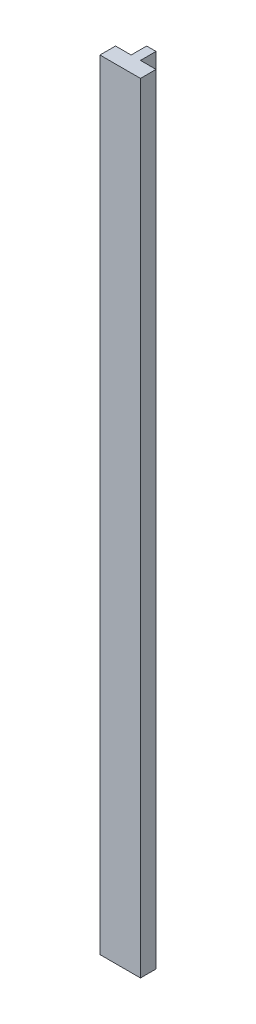
ISO-10303-21;
HEADER;
FILE_DESCRIPTION(('STEP AP214'),'2;1');
FILE_NAME('part.step','',(''),(''),'','','');
FILE_SCHEMA(('AUTOMOTIVE_DESIGN { 1 0 10303 214 1 1 1 1 }'));
ENDSEC;
DATA;
#1=APPLICATION_CONTEXT('core data for automotive mechanical design processes');
#2=APPLICATION_PROTOCOL_DEFINITION('international standard','automotive_design',2000,#1);
#3=PRODUCT_CONTEXT('',#1,'mechanical');
#4=PRODUCT('Part','Part','',(#3));
#5=PRODUCT_RELATED_PRODUCT_CATEGORY('part','',(#4));
#6=PRODUCT_DEFINITION_FORMATION('','',#4);
#7=PRODUCT_DEFINITION_CONTEXT('part definition',#1,'design');
#8=PRODUCT_DEFINITION('design','',#6,#7);
#9=PRODUCT_DEFINITION_SHAPE('','',#8);
#10=(LENGTH_UNIT() NAMED_UNIT(*) SI_UNIT(.MILLI.,.METRE.));
#11=(NAMED_UNIT(*) PLANE_ANGLE_UNIT() SI_UNIT($,.RADIAN.));
#12=(NAMED_UNIT(*) SI_UNIT($,.STERADIAN.) SOLID_ANGLE_UNIT());
#13=UNCERTAINTY_MEASURE_WITH_UNIT(LENGTH_MEASURE(1.E-05),#10,'distance_accuracy_value','');
#14=(GEOMETRIC_REPRESENTATION_CONTEXT(3) GLOBAL_UNCERTAINTY_ASSIGNED_CONTEXT((#13)) GLOBAL_UNIT_ASSIGNED_CONTEXT((#10,
#11,#12)) REPRESENTATION_CONTEXT('',''));
#15=CARTESIAN_POINT('',(0.,0.,0.));
#16=DIRECTION('',(0.,0.,1.));
#17=DIRECTION('',(1.,0.,0.));
#18=AXIS2_PLACEMENT_3D('',#15,#16,#17);
#19=CARTESIAN_POINT('',(0.,500.,10.));
#20=DIRECTION('',(1.,0.,0.));
#21=DIRECTION('',(0.,0.,-1.));
#22=AXIS2_PLACEMENT_3D('',#19,#20,#21);
#23=PLANE('',#22);
#24=DIRECTION('',(0.,0.,1.));
#25=VECTOR('',#24,1.);
#26=CARTESIAN_POINT('',(0.,0.,10.));
#27=LINE('',#26,#25);
#28=CARTESIAN_POINT('',(0.,0.,0.));
#29=VERTEX_POINT('',#28);
#30=CARTESIAN_POINT('',(0.,0.,10.));
#31=VERTEX_POINT('',#30);
#32=EDGE_CURVE('E140',#29,#31,#27,.T.);
#33=ORIENTED_EDGE('',*,*,#32,.T.);
#34=DIRECTION('',(0.,-1.,0.));
#35=VECTOR('',#34,1.);
#36=CARTESIAN_POINT('',(0.,500.,10.));
#37=LINE('',#36,#35);
#38=CARTESIAN_POINT('',(0.,500.,10.));
#39=VERTEX_POINT('',#38);
#40=EDGE_CURVE('E11',#39,#31,#37,.T.);
#41=ORIENTED_EDGE('',*,*,#40,.F.);
#42=DIRECTION('',(0.,0.,1.));
#43=VECTOR('',#42,1.);
#44=CARTESIAN_POINT('',(0.,500.,10.));
#45=LINE('',#44,#43);
#46=CARTESIAN_POINT('',(0.,500.,0.));
#47=VERTEX_POINT('',#46);
#48=EDGE_CURVE('E162',#47,#39,#45,.T.);
#49=ORIENTED_EDGE('',*,*,#48,.F.);
#50=DIRECTION('',(0.,-1.,0.));
#51=VECTOR('',#50,1.);
#52=CARTESIAN_POINT('',(0.,500.,0.));
#53=LINE('',#52,#51);
#54=EDGE_CURVE('E136',#47,#29,#53,.T.);
#55=ORIENTED_EDGE('',*,*,#54,.T.);
#56=EDGE_LOOP('',(#33,#41,#49,#55));
#57=FACE_BOUND('',#56,.T.);
#58=ADVANCED_FACE('F39',(#57),#23,.F.);
#59=CARTESIAN_POINT('',(26.,500.,10.));
#60=DIRECTION('',(0.,0.,-1.));
#61=DIRECTION('',(-1.,0.,0.));
#62=AXIS2_PLACEMENT_3D('',#59,#60,#61);
#63=PLANE('',#62);
#64=DIRECTION('',(1.,0.,0.));
#65=VECTOR('',#64,1.);
#66=CARTESIAN_POINT('',(26.,0.,10.));
#67=LINE('',#66,#65);
#68=CARTESIAN_POINT('',(26.,0.,10.));
#69=VERTEX_POINT('',#68);
#70=EDGE_CURVE('E144',#31,#69,#67,.T.);
#71=ORIENTED_EDGE('',*,*,#70,.T.);
#72=DIRECTION('',(0.,-1.,0.));
#73=VECTOR('',#72,1.);
#74=CARTESIAN_POINT('',(26.,500.,10.));
#75=LINE('',#74,#73);
#76=CARTESIAN_POINT('',(26.,500.,10.));
#77=VERTEX_POINT('',#76);
#78=EDGE_CURVE('E48',#77,#69,#75,.T.);
#79=ORIENTED_EDGE('',*,*,#78,.F.);
#80=DIRECTION('',(1.,0.,0.));
#81=VECTOR('',#80,1.);
#82=CARTESIAN_POINT('',(26.,500.,10.));
#83=LINE('',#82,#81);
#84=EDGE_CURVE('E99',#39,#77,#83,.T.);
#85=ORIENTED_EDGE('',*,*,#84,.F.);
#86=ORIENTED_EDGE('',*,*,#40,.T.);
#87=EDGE_LOOP('',(#71,#79,#85,#86));
#88=FACE_BOUND('',#87,.T.);
#89=ADVANCED_FACE('F208',(#88),#63,.F.);
#90=CARTESIAN_POINT('',(26.,500.,0.));
#91=DIRECTION('',(-1.,0.,0.));
#92=DIRECTION('',(0.,0.,1.));
#93=AXIS2_PLACEMENT_3D('',#90,#91,#92);
#94=PLANE('',#93);
#95=DIRECTION('',(0.,0.,-1.));
#96=VECTOR('',#95,1.);
#97=CARTESIAN_POINT('',(26.,0.,0.));
#98=LINE('',#97,#96);
#99=CARTESIAN_POINT('',(26.,0.,0.));
#100=VERTEX_POINT('',#99);
#101=EDGE_CURVE('E147',#69,#100,#98,.T.);
#102=ORIENTED_EDGE('',*,*,#101,.T.);
#103=DIRECTION('',(0.,-1.,0.));
#104=VECTOR('',#103,1.);
#105=CARTESIAN_POINT('',(26.,500.,0.));
#106=LINE('',#105,#104);
#107=CARTESIAN_POINT('',(26.,500.,0.));
#108=VERTEX_POINT('',#107);
#109=EDGE_CURVE('E173',#108,#100,#106,.T.);
#110=ORIENTED_EDGE('',*,*,#109,.F.);
#111=DIRECTION('',(0.,0.,-1.));
#112=VECTOR('',#111,1.);
#113=CARTESIAN_POINT('',(26.,500.,0.));
#114=LINE('',#113,#112);
#115=EDGE_CURVE('E183',#77,#108,#114,.T.);
#116=ORIENTED_EDGE('',*,*,#115,.F.);
#117=ORIENTED_EDGE('',*,*,#78,.T.);
#118=EDGE_LOOP('',(#102,#110,#116,#117));
#119=FACE_BOUND('',#118,.T.);
#120=ADVANCED_FACE('F181',(#119),#94,.F.);
#121=CARTESIAN_POINT('',(16.,500.,0.));
#122=DIRECTION('',(0.,0.,1.));
#123=DIRECTION('',(1.,0.,0.));
#124=AXIS2_PLACEMENT_3D('',#121,#122,#123);
#125=PLANE('',#124);
#126=DIRECTION('',(-1.,0.,0.));
#127=VECTOR('',#126,1.);
#128=CARTESIAN_POINT('',(16.,0.,0.));
#129=LINE('',#128,#127);
#130=CARTESIAN_POINT('',(16.,0.,0.));
#131=VERTEX_POINT('',#130);
#132=EDGE_CURVE('E150',#100,#131,#129,.T.);
#133=ORIENTED_EDGE('',*,*,#132,.T.);
#134=DIRECTION('',(0.,-1.,0.));
#135=VECTOR('',#134,1.);
#136=CARTESIAN_POINT('',(16.,500.,0.));
#137=LINE('',#136,#135);
#138=CARTESIAN_POINT('',(16.,500.,0.));
#139=VERTEX_POINT('',#138);
#140=EDGE_CURVE('E169',#139,#131,#137,.T.);
#141=ORIENTED_EDGE('',*,*,#140,.F.);
#142=DIRECTION('',(-1.,0.,0.));
#143=VECTOR('',#142,1.);
#144=CARTESIAN_POINT('',(16.,500.,0.));
#145=LINE('',#144,#143);
#146=EDGE_CURVE('E196',#108,#139,#145,.T.);
#147=ORIENTED_EDGE('',*,*,#146,.F.);
#148=ORIENTED_EDGE('',*,*,#109,.T.);
#149=EDGE_LOOP('',(#133,#141,#147,#148));
#150=FACE_BOUND('',#149,.T.);
#151=ADVANCED_FACE('F191',(#150),#125,.F.);
#152=CARTESIAN_POINT('',(16.,500.,-10.));
#153=DIRECTION('',(-1.,0.,0.));
#154=DIRECTION('',(0.,0.,1.));
#155=AXIS2_PLACEMENT_3D('',#152,#153,#154);
#156=PLANE('',#155);
#157=DIRECTION('',(0.,0.,-1.));
#158=VECTOR('',#157,1.);
#159=CARTESIAN_POINT('',(16.,0.,-10.));
#160=LINE('',#159,#158);
#161=CARTESIAN_POINT('',(16.,0.,-10.));
#162=VERTEX_POINT('',#161);
#163=EDGE_CURVE('E153',#131,#162,#160,.T.);
#164=ORIENTED_EDGE('',*,*,#163,.T.);
#165=DIRECTION('',(0.,-1.,0.));
#166=VECTOR('',#165,1.);
#167=CARTESIAN_POINT('',(16.,500.,-10.));
#168=LINE('',#167,#166);
#169=CARTESIAN_POINT('',(16.,500.,-10.));
#170=VERTEX_POINT('',#169);
#171=EDGE_CURVE('E129',#170,#162,#168,.T.);
#172=ORIENTED_EDGE('',*,*,#171,.F.);
#173=DIRECTION('',(0.,0.,-1.));
#174=VECTOR('',#173,1.);
#175=CARTESIAN_POINT('',(16.,500.,-10.));
#176=LINE('',#175,#174);
#177=EDGE_CURVE('E118',#139,#170,#176,.T.);
#178=ORIENTED_EDGE('',*,*,#177,.F.);
#179=ORIENTED_EDGE('',*,*,#140,.T.);
#180=EDGE_LOOP('',(#164,#172,#178,#179));
#181=FACE_BOUND('',#180,.T.);
#182=ADVANCED_FACE('F194',(#181),#156,.F.);
#183=CARTESIAN_POINT('',(10.,500.,-10.));
#184=DIRECTION('',(0.,0.,1.));
#185=DIRECTION('',(1.,0.,0.));
#186=AXIS2_PLACEMENT_3D('',#183,#184,#185);
#187=PLANE('',#186);
#188=DIRECTION('',(-1.,0.,0.));
#189=VECTOR('',#188,1.);
#190=CARTESIAN_POINT('',(10.,0.,-10.));
#191=LINE('',#190,#189);
#192=CARTESIAN_POINT('',(10.,0.,-10.));
#193=VERTEX_POINT('',#192);
#194=EDGE_CURVE('E127',#162,#193,#191,.T.);
#195=ORIENTED_EDGE('',*,*,#194,.T.);
#196=DIRECTION('',(0.,-1.,0.));
#197=VECTOR('',#196,1.);
#198=CARTESIAN_POINT('',(10.,500.,-10.));
#199=LINE('',#198,#197);
#200=CARTESIAN_POINT('',(10.,500.,-10.));
#201=VERTEX_POINT('',#200);
#202=EDGE_CURVE('E124',#201,#193,#199,.T.);
#203=ORIENTED_EDGE('',*,*,#202,.F.);
#204=DIRECTION('',(-1.,0.,0.));
#205=VECTOR('',#204,1.);
#206=CARTESIAN_POINT('',(10.,500.,-10.));
#207=LINE('',#206,#205);
#208=EDGE_CURVE('E112',#170,#201,#207,.T.);
#209=ORIENTED_EDGE('',*,*,#208,.F.);
#210=ORIENTED_EDGE('',*,*,#171,.T.);
#211=EDGE_LOOP('',(#195,#203,#209,#210));
#212=FACE_BOUND('',#211,.T.);
#213=ADVANCED_FACE('F125',(#212),#187,.F.);
#214=CARTESIAN_POINT('',(10.,500.,0.));
#215=DIRECTION('',(1.,0.,0.));
#216=DIRECTION('',(0.,0.,-1.));
#217=AXIS2_PLACEMENT_3D('',#214,#215,#216);
#218=PLANE('',#217);
#219=DIRECTION('',(0.,0.,1.));
#220=VECTOR('',#219,1.);
#221=CARTESIAN_POINT('',(10.,0.,0.));
#222=LINE('',#221,#220);
#223=CARTESIAN_POINT('',(10.,0.,0.));
#224=VERTEX_POINT('',#223);
#225=EDGE_CURVE('E85',#193,#224,#222,.T.);
#226=ORIENTED_EDGE('',*,*,#225,.T.);
#227=DIRECTION('',(0.,-1.,0.));
#228=VECTOR('',#227,1.);
#229=CARTESIAN_POINT('',(10.,500.,0.));
#230=LINE('',#229,#228);
#231=CARTESIAN_POINT('',(10.,500.,0.));
#232=VERTEX_POINT('',#231);
#233=EDGE_CURVE('E130',#232,#224,#230,.T.);
#234=ORIENTED_EDGE('',*,*,#233,.F.);
#235=DIRECTION('',(0.,0.,1.));
#236=VECTOR('',#235,1.);
#237=CARTESIAN_POINT('',(10.,500.,0.));
#238=LINE('',#237,#236);
#239=EDGE_CURVE('E116',#201,#232,#238,.T.);
#240=ORIENTED_EDGE('',*,*,#239,.F.);
#241=ORIENTED_EDGE('',*,*,#202,.T.);
#242=EDGE_LOOP('',(#226,#234,#240,#241));
#243=FACE_BOUND('',#242,.T.);
#244=ADVANCED_FACE('F132',(#243),#218,.F.);
#245=CARTESIAN_POINT('',(0.,500.,0.));
#246=DIRECTION('',(0.,0.,1.));
#247=DIRECTION('',(1.,0.,0.));
#248=AXIS2_PLACEMENT_3D('',#245,#246,#247);
#249=PLANE('',#248);
#250=DIRECTION('',(-1.,0.,0.));
#251=VECTOR('',#250,1.);
#252=CARTESIAN_POINT('',(0.,0.,0.));
#253=LINE('',#252,#251);
#254=EDGE_CURVE('E91',#224,#29,#253,.T.);
#255=ORIENTED_EDGE('',*,*,#254,.T.);
#256=ORIENTED_EDGE('',*,*,#54,.F.);
#257=DIRECTION('',(-1.,0.,0.));
#258=VECTOR('',#257,1.);
#259=CARTESIAN_POINT('',(0.,500.,0.));
#260=LINE('',#259,#258);
#261=EDGE_CURVE('E56',#232,#47,#260,.T.);
#262=ORIENTED_EDGE('',*,*,#261,.F.);
#263=ORIENTED_EDGE('',*,*,#233,.T.);
#264=EDGE_LOOP('',(#255,#256,#262,#263));
#265=FACE_BOUND('',#264,.T.);
#266=ADVANCED_FACE('F224',(#265),#249,.F.);
#267=CARTESIAN_POINT('',(0.,500.,0.));
#268=DIRECTION('',(0.,-1.,0.));
#269=DIRECTION('',(0.,0.,-1.));
#270=AXIS2_PLACEMENT_3D('',#267,#268,#269);
#271=PLANE('',#270);
#272=ORIENTED_EDGE('',*,*,#48,.T.);
#273=ORIENTED_EDGE('',*,*,#84,.T.);
#274=ORIENTED_EDGE('',*,*,#115,.T.);
#275=ORIENTED_EDGE('',*,*,#146,.T.);
#276=ORIENTED_EDGE('',*,*,#177,.T.);
#277=ORIENTED_EDGE('',*,*,#208,.T.);
#278=ORIENTED_EDGE('',*,*,#239,.T.);
#279=ORIENTED_EDGE('',*,*,#261,.T.);
#280=EDGE_LOOP('',(#272,#273,#274,#275,#276,#277,#278,#279));
#281=FACE_BOUND('',#280,.T.);
#282=ADVANCED_FACE('F114',(#281),#271,.F.);
#283=CARTESIAN_POINT('',(0.,0.,0.));
#284=DIRECTION('',(0.,-1.,0.));
#285=DIRECTION('',(0.,0.,-1.));
#286=AXIS2_PLACEMENT_3D('',#283,#284,#285);
#287=PLANE('',#286);
#288=ORIENTED_EDGE('',*,*,#32,.F.);
#289=ORIENTED_EDGE('',*,*,#254,.F.);
#290=ORIENTED_EDGE('',*,*,#225,.F.);
#291=ORIENTED_EDGE('',*,*,#194,.F.);
#292=ORIENTED_EDGE('',*,*,#163,.F.);
#293=ORIENTED_EDGE('',*,*,#132,.F.);
#294=ORIENTED_EDGE('',*,*,#101,.F.);
#295=ORIENTED_EDGE('',*,*,#70,.F.);
#296=EDGE_LOOP('',(#288,#289,#290,#291,#292,#293,#294,#295));
#297=FACE_BOUND('',#296,.T.);
#298=ADVANCED_FACE('F187',(#297),#287,.T.);
#299=CLOSED_SHELL('',(#58,#89,#120,#151,#182,#213,#244,#266,#282,#298));
#300=MANIFOLD_SOLID_BREP('B2',#299);
#301=ADVANCED_BREP_SHAPE_REPRESENTATION('',(#18,#300),#14);
#302=SHAPE_DEFINITION_REPRESENTATION(#9,#301);
ENDSEC;
END-ISO-10303-21;
